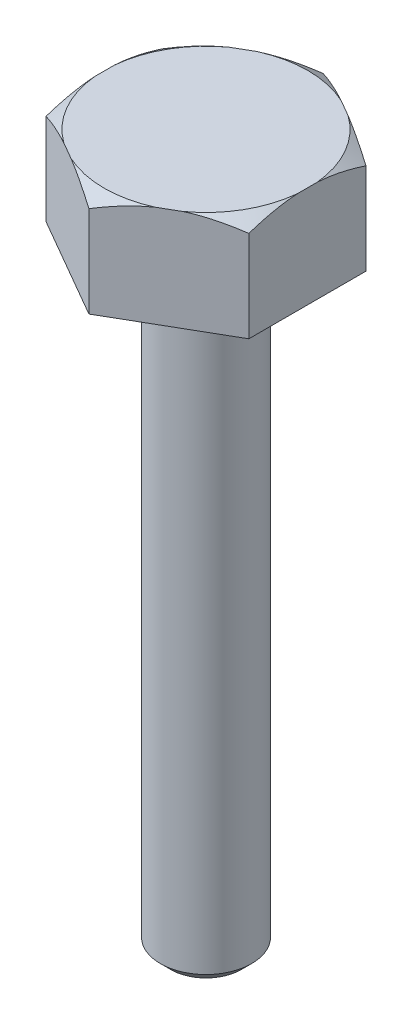
ISO-10303-21;
HEADER;
FILE_DESCRIPTION(('STEP AP214'),'2;1');
FILE_NAME('part.step','',(''),(''),'','','');
FILE_SCHEMA(('AUTOMOTIVE_DESIGN { 1 0 10303 214 1 1 1 1 }'));
ENDSEC;
DATA;
#1=APPLICATION_CONTEXT('core data for automotive mechanical design processes');
#2=APPLICATION_PROTOCOL_DEFINITION('international standard','automotive_design',2000,#1);
#3=PRODUCT_CONTEXT('',#1,'mechanical');
#4=PRODUCT('Part','Part','',(#3));
#5=PRODUCT_RELATED_PRODUCT_CATEGORY('part','',(#4));
#6=PRODUCT_DEFINITION_FORMATION('','',#4);
#7=PRODUCT_DEFINITION_CONTEXT('part definition',#1,'design');
#8=PRODUCT_DEFINITION('design','',#6,#7);
#9=PRODUCT_DEFINITION_SHAPE('','',#8);
#10=(LENGTH_UNIT() NAMED_UNIT(*) SI_UNIT(.MILLI.,.METRE.));
#11=(NAMED_UNIT(*) PLANE_ANGLE_UNIT() SI_UNIT($,.RADIAN.));
#12=(NAMED_UNIT(*) SI_UNIT($,.STERADIAN.) SOLID_ANGLE_UNIT());
#13=UNCERTAINTY_MEASURE_WITH_UNIT(LENGTH_MEASURE(1.E-05),#10,'distance_accuracy_value','');
#14=(GEOMETRIC_REPRESENTATION_CONTEXT(3) GLOBAL_UNCERTAINTY_ASSIGNED_CONTEXT((#13)) GLOBAL_UNIT_ASSIGNED_CONTEXT((#10,
#11,#12)) REPRESENTATION_CONTEXT('',''));
#15=CARTESIAN_POINT('',(0.,0.,0.));
#16=DIRECTION('',(0.,0.,1.));
#17=DIRECTION('',(1.,0.,0.));
#18=AXIS2_PLACEMENT_3D('',#15,#16,#17);
#19=CARTESIAN_POINT('',(10.,10.,5.77350269189626));
#20=DIRECTION('',(-1.,0.,0.));
#21=DIRECTION('',(0.,0.,1.));
#22=AXIS2_PLACEMENT_3D('',#19,#20,#21);
#23=PLANE('',#22);
#24=CARTESIAN_POINT('',(10.,5.90710487205311,12.7278381521818));
#25=CARTESIAN_POINT('',(10.,6.0793608945057,12.3991739928138));
#26=CARTESIAN_POINT('',(10.,6.24968099015636,12.0694790466941));
#27=CARTESIAN_POINT('',(10.,6.58558397838257,11.4076219385313));
#28=CARTESIAN_POINT('',(10.,6.75116612019231,11.0754593958673));
#29=CARTESIAN_POINT('',(10.,7.07732703508568,10.407024430958));
#30=CARTESIAN_POINT('',(10.,7.23788302774356,10.0707408569199));
#31=CARTESIAN_POINT('',(10.,7.55210202224716,9.39497602551654));
#32=CARTESIAN_POINT('',(10.,7.70576530282682,9.05549489813003));
#33=CARTESIAN_POINT('',(10.,8.00927566950978,8.36252264170041));
#34=CARTESIAN_POINT('',(10.,8.15886619139366,8.00891861228615));
#35=CARTESIAN_POINT('',(10.,8.4472048566987,7.29726965705877));
#36=CARTESIAN_POINT('',(10.,8.58595232444728,6.9392244561074));
#37=CARTESIAN_POINT('',(10.,8.84995208670938,6.21870019113016));
#38=CARTESIAN_POINT('',(10.,8.97522243658759,5.85622780231769));
#39=CARTESIAN_POINT('',(10.,9.20950318873454,5.12611915020338));
#40=CARTESIAN_POINT('',(10.,9.31851639916821,4.7584837907556));
#41=CARTESIAN_POINT('',(10.,9.5438112265742,3.91739891893107));
#42=CARTESIAN_POINT('',(10.,9.65405513012926,3.44227582673843));
#43=CARTESIAN_POINT('',(10.,9.7901035463059,2.72409819473514));
#44=CARTESIAN_POINT('',(10.,9.83056825541876,2.48377623878417));
#45=CARTESIAN_POINT('',(10.,9.90090920007325,2.00159868929574));
#46=CARTESIAN_POINT('',(10.,9.93078683361545,1.75974330254088));
#47=CARTESIAN_POINT('',(10.,9.97896446679237,1.27801559182015));
#48=CARTESIAN_POINT('',(10.,9.99740826493851,1.03815770536422));
#49=CARTESIAN_POINT('',(10.,10.0228797231995,0.557835301316692));
#50=CARTESIAN_POINT('',(10.,10.0299075686807,0.317370793638596));
#51=CARTESIAN_POINT('',(10.,10.0323722742339,-0.163616190497004));
#52=CARTESIAN_POINT('',(10.,10.0278092726359,-0.404138666228438));
#53=CARTESIAN_POINT('',(10.,10.0072085105673,-0.884692060751066));
#54=CARTESIAN_POINT('',(10.,9.99117033460514,-1.12472296142777));
#55=CARTESIAN_POINT('',(10.,9.94316490868695,-1.65739414366833));
#56=CARTESIAN_POINT('',(10.,9.90843636972063,-1.94978825759404));
#57=CARTESIAN_POINT('',(10.,9.82352041266941,-2.5322999579852));
#58=CARTESIAN_POINT('',(10.,9.77333166127009,-2.82241734588821));
#59=CARTESIAN_POINT('',(10.,9.60171649432357,-3.68890923952759));
#60=CARTESIAN_POINT('',(10.,9.45926389047211,-4.2611943504674));
#61=CARTESIAN_POINT('',(10.,9.21223995234808,-5.11364139885107));
#62=CARTESIAN_POINT('',(10.,9.12363063044356,-5.39868822190394));
#63=CARTESIAN_POINT('',(10.,8.93689518426824,-5.96565181537131));
#64=CARTESIAN_POINT('',(10.,8.83876970691451,-6.24756879710526));
#65=CARTESIAN_POINT('',(10.,8.63440863817487,-6.80835229691252));
#66=CARTESIAN_POINT('',(10.,8.52817485639805,-7.08721947984736));
#67=CARTESIAN_POINT('',(10.,8.30876965193712,-7.64219843636143));
#68=CARTESIAN_POINT('',(10.,8.19559832320646,-7.91831024719711));
#69=CARTESIAN_POINT('',(10.,7.9146653538985,-8.58323815267785));
#70=CARTESIAN_POINT('',(10.,7.74390466905314,-8.97078570232952));
#71=CARTESIAN_POINT('',(10.,7.39286933651772,-9.74148543574943));
#72=CARTESIAN_POINT('',(10.,7.21259541129671,-10.1246379506095));
#73=CARTESIAN_POINT('',(10.,6.84807916806974,-10.8795038731173));
#74=CARTESIAN_POINT('',(10.,6.66399094175462,-11.2512918755448));
#75=CARTESIAN_POINT('',(10.,6.38334017731839,-11.8066579263679));
#76=CARTESIAN_POINT('',(10.,6.28904124641967,-11.9913855961491));
#77=CARTESIAN_POINT('',(10.,6.09906999520468,-12.36012988653));
#78=CARTESIAN_POINT('',(10.,6.00339769671645,-12.5441465183719));
#79=CARTESIAN_POINT('',(10.,5.90710487205311,-12.7278381521818));
#80=B_SPLINE_CURVE_WITH_KNOTS('',3,(#24,#25,#26,#27,#28,#29,#30,#31,#32,#33,#34,#35,#36,#37,#38,
#39,#40,#41,#42,#43,#44,#45,#46,#47,#48,#49,#50,#51,#52,#53,#54,#55,#56,#57,#58,#59,#60,#61,#62,
#63,#64,#65,#66,#67,#68,#69,#70,#71,#72,#73,#74,#75,#76,#77,#78,#79),.UNSPECIFIED.,.F.,.F.,(4,2,
2,2,2,2,2,2,2,2,2,2,2,2,2,2,2,2,2,2,2,2,2,2,2,2,2,4),(0.,1.1132220881002,2.22661960890332,
3.34449140753772,4.46231795979545,5.61400246244217,6.76575867386764,7.91595213551715,
9.06594668865214,10.527621110013,11.2585419996432,11.989366336743,12.7108023269516,
13.4322266027293,14.1536422687566,14.8750840570248,15.7579562722943,16.6409046492578,
18.4074890402685,19.3028973916684,20.1982449149911,21.0933931959392,21.9885293567959,
23.2588570642324,24.5290884369467,25.7736192532948,26.3958280254714,27.0180269193105),.UNSPECIFIED.);
#81=CARTESIAN_POINT('',(10.,9.,5.77350269189626));
#82=VERTEX_POINT('',#81);
#83=CARTESIAN_POINT('',(10.,10.,0.970730231297982));
#84=VERTEX_POINT('',#83);
#85=EDGE_CURVE('E213',#82,#84,#80,.T.);
#86=ORIENTED_EDGE('',*,*,#85,.F.);
#87=DIRECTION('',(0.,-1.,0.));
#88=VECTOR('',#87,1.);
#89=CARTESIAN_POINT('',(10.,10.,5.77350269189626));
#90=LINE('',#89,#88);
#91=CARTESIAN_POINT('',(10.,0.,5.77350269189626));
#92=VERTEX_POINT('',#91);
#93=EDGE_CURVE('E166',#82,#92,#90,.T.);
#94=ORIENTED_EDGE('',*,*,#93,.T.);
#95=DIRECTION('',(0.,0.,-1.));
#96=VECTOR('',#95,1.);
#97=CARTESIAN_POINT('',(10.,0.,5.77350269189626));
#98=LINE('',#97,#96);
#99=CARTESIAN_POINT('',(10.,0.,-5.77350269189626));
#100=VERTEX_POINT('',#99);
#101=EDGE_CURVE('E167',#92,#100,#98,.T.);
#102=ORIENTED_EDGE('',*,*,#101,.T.);
#103=DIRECTION('',(0.,-1.,0.));
#104=VECTOR('',#103,1.);
#105=CARTESIAN_POINT('',(10.,10.,-5.77350269189626));
#106=LINE('',#105,#104);
#107=CARTESIAN_POINT('',(10.,9.,-5.77350269189626));
#108=VERTEX_POINT('',#107);
#109=EDGE_CURVE('E192',#108,#100,#106,.T.);
#110=ORIENTED_EDGE('',*,*,#109,.F.);
#111=CARTESIAN_POINT('',(10.,10.,-0.970730231297985));
#112=VERTEX_POINT('',#111);
#113=EDGE_CURVE('E171',#112,#108,#80,.T.);
#114=ORIENTED_EDGE('',*,*,#113,.F.);
#115=DIRECTION('',(0.,0.,-1.));
#116=VECTOR('',#115,1.);
#117=CARTESIAN_POINT('',(10.,10.,5.77350269189626));
#118=LINE('',#117,#116);
#119=EDGE_CURVE('E152',#84,#112,#118,.T.);
#120=ORIENTED_EDGE('',*,*,#119,.F.);
#121=EDGE_LOOP('',(#86,#94,#102,#110,#114,#120));
#122=FACE_BOUND('',#121,.T.);
#123=ADVANCED_FACE('F36',(#122),#23,.F.);
#124=CARTESIAN_POINT('',(10.,10.,-5.77350269189626));
#125=DIRECTION('',(-0.5,0.,0.866025403784439));
#126=DIRECTION('',(0.866025403784439,0.,0.5));
#127=AXIS2_PLACEMENT_3D('',#124,#125,#126);
#128=PLANE('',#127);
#129=CARTESIAN_POINT('',(16.9543354602855,5.33448466897945,-1.75841524186548));
#130=CARTESIAN_POINT('',(16.6704137607809,5.51145277088848,-1.92233751150323));
#131=CARTESIAN_POINT('',(16.3857196591728,5.68678909450409,-2.08670572770335));
#132=CARTESIAN_POINT('',(15.8144915562484,6.03350198488177,-2.41650442669546));
#133=CARTESIAN_POINT('',(15.5279573620131,6.20487812749486,-2.5819350208692));
#134=CARTESIAN_POINT('',(14.9520245008826,6.54340070743476,-2.91445001327807));
#135=CARTESIAN_POINT('',(14.6626201277199,6.71053423355476,-3.08153770602822));
#136=CARTESIAN_POINT('',(14.0814138970546,7.03913600953292,-3.41709727975749));
#137=CARTESIAN_POINT('',(13.7896121071779,7.20060441851889,-3.58556912169285));
#138=CARTESIAN_POINT('',(13.1922435480544,7.52265202608774,-3.93046002010821));
#139=CARTESIAN_POINT('',(12.886571036726,7.682970656885,-4.10694012680755));
#140=CARTESIAN_POINT('',(12.2717880587656,7.99464932850734,-4.46188524462614));
#141=CARTESIAN_POINT('',(11.9626774287477,8.14600894140303,-4.6403503500764));
#142=CARTESIAN_POINT('',(11.3408408593908,8.43759366634361,-4.99936786078655));
#143=CARTESIAN_POINT('',(11.0281184092735,8.57782863793539,-5.17991825154337));
#144=CARTESIAN_POINT('',(10.3983945917163,8.84477102159408,-5.54348946712514));
#145=CARTESIAN_POINT('',(10.0813937649079,8.97148012514163,-5.72650997981632));
#146=CARTESIAN_POINT('',(9.35638854026435,9.24040337276739,-6.14509194142816));
#147=CARTESIAN_POINT('',(8.94695084408709,9.37754811232443,-6.38148090553249));
#148=CARTESIAN_POINT('',(8.12049296208359,9.6178672707041,-6.8586365861811));
#149=CARTESIAN_POINT('',(7.70347355423212,9.72104515440548,-7.09940285356144));
#150=CARTESIAN_POINT('',(7.07646123997761,9.84412014332748,-7.46140858198149));
#151=CARTESIAN_POINT('',(6.86874036610463,9.87971486939361,-7.58133628442836));
#152=CARTESIAN_POINT('',(6.45210967836269,9.94010302166208,-7.82187812414883));
#153=CARTESIAN_POINT('',(6.24319987799829,9.96489657030385,-7.94249225362557));
#154=CARTESIAN_POINT('',(5.82463252595282,10.0030927826117,-8.18415222700301));
#155=CARTESIAN_POINT('',(5.61497510550477,10.0164973552735,-8.30519799513629));
#156=CARTESIAN_POINT('',(5.19534157967948,10.0315930622517,-8.54747352423252));
#157=CARTESIAN_POINT('',(4.985365474736,10.0332842124966,-8.66870328494502));
#158=CARTESIAN_POINT('',(4.56484506581673,10.024894612638,-8.9114908562343));
#159=CARTESIAN_POINT('',(4.3543013916357,10.0147720423244,-9.03304830319889));
#160=CARTESIAN_POINT('',(3.93387618451524,9.98294146890358,-9.27578090970399));
#161=CARTESIAN_POINT('',(3.72399465548885,9.96123339745866,-9.3969560669853));
#162=CARTESIAN_POINT('',(3.30528455326484,9.90674675318179,-9.63869845721675));
#163=CARTESIAN_POINT('',(3.09645615011703,9.87396644714387,-9.75926559198858));
#164=CARTESIAN_POINT('',(2.68020424868778,9.79806123324148,-9.99958873932945));
#165=CARTESIAN_POINT('',(2.47278093049621,9.7549350242044,-10.1193446479236));
#166=CARTESIAN_POINT('',(1.84700505701181,9.60991413336595,-10.4806365169322));
#167=CARTESIAN_POINT('',(1.43119724267965,9.49320530038334,-10.720703270468));
#168=CARTESIAN_POINT('',(0.607340392312998,9.22836185810968,-11.1963572448009));
#169=CARTESIAN_POINT('',(0.199291716875844,9.0802257921435,-11.431944257407));
#170=CARTESIAN_POINT('',(-0.503328503874636,8.80158574903133,-11.8376022309954));
#171=CARTESIAN_POINT('',(-0.799582442185761,8.67665383395842,-12.0086445220278));
#172=CARTESIAN_POINT('',(-1.388449257834,8.41578651425678,-12.3486269365591));
#173=CARTESIAN_POINT('',(-1.6810618335193,8.27985020492911,-12.5175668858993));
#174=CARTESIAN_POINT('',(-2.26316262285532,7.99884677130784,-12.8536429333179));
#175=CARTESIAN_POINT('',(-2.55264892009115,7.85377438171831,-13.0207779249538));
#176=CARTESIAN_POINT('',(-3.12872215724987,7.55614106935374,-13.3533739635003));
#177=CARTESIAN_POINT('',(-3.41530899537535,7.40357988474669,-13.5188349516382));
#178=CARTESIAN_POINT('',(-3.97604761078438,7.09764282591256,-13.8425775421896));
#179=CARTESIAN_POINT('',(-4.25028616713557,6.94447836928975,-14.0009092465212));
#180=CARTESIAN_POINT('',(-4.79668855480026,6.63328437427349,-14.3163748121252));
#181=CARTESIAN_POINT('',(-5.06885234132085,6.47525473121289,-14.4735086475366));
#182=CARTESIAN_POINT('',(-5.61082202718766,6.15541192138462,-14.7864149915644));
#183=CARTESIAN_POINT('',(-5.88063153509444,5.99360688945241,-14.9421895835843));
#184=CARTESIAN_POINT('',(-6.4186347822641,5.6665138915747,-15.2528059031626));
#185=CARTESIAN_POINT('',(-6.68682865499916,5.5012262185582,-15.4076477077812));
#186=CARTESIAN_POINT('',(-6.95433546028548,5.33448466897945,-15.5620928338233));
#187=B_SPLINE_CURVE_WITH_KNOTS('',3,(#129,#130,#131,#132,#133,#134,#135,#136,#137,#138,#139,
#140,#141,#142,#143,#144,#145,#146,#147,#148,#149,#150,#151,#152,#153,#154,#155,#156,#157,#158,
#159,#160,#161,#162,#163,#164,#165,#166,#167,#168,#169,#170,#171,#172,#173,#174,#175,#176,#177,
#178,#179,#180,#181,#182,#183,#184,#185,#186),.UNSPECIFIED.,.F.,.F.,(4,2,2,2,2,2,2,2,2,2,2,2,2,
2,2,2,2,2,2,2,2,2,2,2,2,2,2,2,4),(0.,1.11768502353013,2.23548920527297,3.35636377904495,
4.4772068432577,5.64009509576005,6.80303884911568,7.96494011798363,9.12669591436867,
10.602535349934,12.0782241919218,12.8054650783283,13.5326977207007,14.2598084418315,
14.9869181741972,15.7166096799222,16.4463054898204,17.1761155765329,17.9060174973924,
19.3868621036758,20.8677753631874,21.9601216940293,23.0525579207918,24.1456296053234,
25.2387395343665,26.2939712635857,27.3492257104102,28.4023850301391,29.4554561182629),.UNSPECIFIED.);
#188=CARTESIAN_POINT('',(5.8406770405256,10.,-8.1748889221954));
#189=VERTEX_POINT('',#188);
#190=EDGE_CURVE('E145',#108,#189,#187,.T.);
#191=ORIENTED_EDGE('',*,*,#190,.F.);
#192=ORIENTED_EDGE('',*,*,#109,.T.);
#193=DIRECTION('',(-0.866025403784439,0.,-0.5));
#194=VECTOR('',#193,1.);
#195=CARTESIAN_POINT('',(10.,0.,-5.77350269189626));
#196=LINE('',#195,#194);
#197=CARTESIAN_POINT('',(0.,0.,-11.5470053837925));
#198=VERTEX_POINT('',#197);
#199=EDGE_CURVE('E170',#100,#198,#196,.T.);
#200=ORIENTED_EDGE('',*,*,#199,.T.);
#201=DIRECTION('',(0.,-1.,0.));
#202=VECTOR('',#201,1.);
#203=CARTESIAN_POINT('',(0.,10.,-11.5470053837925));
#204=LINE('',#203,#202);
#205=CARTESIAN_POINT('',(0.,9.,-11.5470053837925));
#206=VERTEX_POINT('',#205);
#207=EDGE_CURVE('E144',#206,#198,#204,.T.);
#208=ORIENTED_EDGE('',*,*,#207,.F.);
#209=CARTESIAN_POINT('',(4.1593229594744,10.,-9.14561915349338));
#210=VERTEX_POINT('',#209);
#211=EDGE_CURVE('E127',#210,#206,#187,.T.);
#212=ORIENTED_EDGE('',*,*,#211,.F.);
#213=DIRECTION('',(-0.866025403784439,0.,-0.5));
#214=VECTOR('',#213,1.);
#215=CARTESIAN_POINT('',(10.,10.,-5.77350269189626));
#216=LINE('',#215,#214);
#217=EDGE_CURVE('E142',#189,#210,#216,.T.);
#218=ORIENTED_EDGE('',*,*,#217,.F.);
#219=EDGE_LOOP('',(#191,#192,#200,#208,#212,#218));
#220=FACE_BOUND('',#219,.T.);
#221=ADVANCED_FACE('F141',(#220),#128,.F.);
#222=CARTESIAN_POINT('',(0.,10.,-11.5470053837925));
#223=DIRECTION('',(0.5,0.,0.866025403784439));
#224=DIRECTION('',(0.866025403784439,0.,-0.5));
#225=AXIS2_PLACEMENT_3D('',#222,#223,#224);
#226=PLANE('',#225);
#227=CARTESIAN_POINT('',(6.95433546028548,5.33448466897945,-15.5620928338233));
#228=CARTESIAN_POINT('',(6.67041376078089,5.51145277088848,-15.3981705641855));
#229=CARTESIAN_POINT('',(6.38571965917281,5.68678909450409,-15.2338023479854));
#230=CARTESIAN_POINT('',(5.81449155624836,6.03350198488177,-14.9040036489933));
#231=CARTESIAN_POINT('',(5.52795736201314,6.20487812749486,-14.7385730548196));
#232=CARTESIAN_POINT('',(4.9520245008826,6.54340070743476,-14.4060580624107));
#233=CARTESIAN_POINT('',(4.66262012771988,6.71053423355476,-14.2389703696606));
#234=CARTESIAN_POINT('',(4.08141389705462,7.03913600953292,-13.9034107959313));
#235=CARTESIAN_POINT('',(3.78961210717787,7.20060441851889,-13.7349389539959));
#236=CARTESIAN_POINT('',(3.19224354805439,7.52265202608774,-13.3900480555806));
#237=CARTESIAN_POINT('',(2.88657103672596,7.68297065688501,-13.2135679488812));
#238=CARTESIAN_POINT('',(2.27178805876564,7.99464932850734,-12.8586228310626));
#239=CARTESIAN_POINT('',(1.96267742874766,8.14600894140303,-12.6801577256124));
#240=CARTESIAN_POINT('',(1.34084085939078,8.43759366634361,-12.3211402149022));
#241=CARTESIAN_POINT('',(1.02811840927355,8.57782863793539,-12.1405898241454));
#242=CARTESIAN_POINT('',(0.398394591716341,8.84477102159408,-11.7770186085636));
#243=CARTESIAN_POINT('',(0.0813937649079103,8.97148012514163,-11.5939980958725));
#244=CARTESIAN_POINT('',(-0.643611459735645,9.24040337276739,-11.1754161342606));
#245=CARTESIAN_POINT('',(-1.05304915591291,9.37754811232444,-10.9390271701563));
#246=CARTESIAN_POINT('',(-1.87950703791641,9.6178672707041,-10.4618714895077));
#247=CARTESIAN_POINT('',(-2.29652644576788,9.72104515440548,-10.2211052221273));
#248=CARTESIAN_POINT('',(-2.92353876002239,9.84412014332748,-9.85909949370729));
#249=CARTESIAN_POINT('',(-3.13125963389537,9.87971486939361,-9.73917179126042));
#250=CARTESIAN_POINT('',(-3.54789032163732,9.94010302166208,-9.49862995153995));
#251=CARTESIAN_POINT('',(-3.75680012200171,9.96489657030385,-9.37801582206321));
#252=CARTESIAN_POINT('',(-4.17536747404718,10.0030927826117,-9.13635584868578));
#253=CARTESIAN_POINT('',(-4.38502489449523,10.0164973552735,-9.01531008055249));
#254=CARTESIAN_POINT('',(-4.80465842032052,10.0315930622517,-8.77303455145627));
#255=CARTESIAN_POINT('',(-5.014634525264,10.0332842124966,-8.65180479074376));
#256=CARTESIAN_POINT('',(-5.43515493418327,10.024894612638,-8.40901721945449));
#257=CARTESIAN_POINT('',(-5.6456986083643,10.0147720423244,-8.2874597724899));
#258=CARTESIAN_POINT('',(-6.06612381548476,9.98294146890358,-8.04472716598479));
#259=CARTESIAN_POINT('',(-6.27600534451115,9.96123339745866,-7.92355200870348));
#260=CARTESIAN_POINT('',(-6.69471544673516,9.90674675318179,-7.68180961847203));
#261=CARTESIAN_POINT('',(-6.90354384988297,9.87396644714387,-7.56124248370021));
#262=CARTESIAN_POINT('',(-7.31979575131222,9.79806123324148,-7.32091933635933));
#263=CARTESIAN_POINT('',(-7.52721906950379,9.7549350242044,-7.20116342776522));
#264=CARTESIAN_POINT('',(-8.15299494298819,9.60991413336595,-6.83987155875663));
#265=CARTESIAN_POINT('',(-8.56880275732035,9.49320530038334,-6.59980480522081));
#266=CARTESIAN_POINT('',(-9.392659607687,9.22836185810968,-6.12415083088791));
#267=CARTESIAN_POINT('',(-9.80070828312416,9.0802257921435,-5.88856381828179));
#268=CARTESIAN_POINT('',(-10.5033285038746,8.80158574903133,-5.48290584469343));
#269=CARTESIAN_POINT('',(-10.7995824421858,8.67665383395842,-5.31186355366102));
#270=CARTESIAN_POINT('',(-11.388449257834,8.41578651425678,-4.97188113912967));
#271=CARTESIAN_POINT('',(-11.6810618335193,8.27985020492911,-4.80294118978949));
#272=CARTESIAN_POINT('',(-12.2631626228553,7.99884677130784,-4.46686514237085));
#273=CARTESIAN_POINT('',(-12.5526489200912,7.85377438171831,-4.29973015073503));
#274=CARTESIAN_POINT('',(-13.1287221572499,7.55614106935375,-3.96713411218851));
#275=CARTESIAN_POINT('',(-13.4153089953753,7.40357988474669,-3.80167312405056));
#276=CARTESIAN_POINT('',(-13.9760476107844,7.09764282591256,-3.47793053349914));
#277=CARTESIAN_POINT('',(-14.2502861671356,6.94447836928975,-3.31959882916761));
#278=CARTESIAN_POINT('',(-14.7966885548003,6.63328437427349,-3.00413326356354));
#279=CARTESIAN_POINT('',(-15.0688523413208,6.47525473121289,-2.84699942815221));
#280=CARTESIAN_POINT('',(-15.6108220271877,6.15541192138462,-2.53409308412439));
#281=CARTESIAN_POINT('',(-15.8806315350944,5.99360688945241,-2.37831849210449));
#282=CARTESIAN_POINT('',(-16.4186347822641,5.6665138915747,-2.06770217252619));
#283=CARTESIAN_POINT('',(-16.6868286549992,5.5012262185582,-1.9128603679076));
#284=CARTESIAN_POINT('',(-16.9543354602855,5.33448466897945,-1.75841524186548));
#285=B_SPLINE_CURVE_WITH_KNOTS('',3,(#227,#228,#229,#230,#231,#232,#233,#234,#235,#236,#237,
#238,#239,#240,#241,#242,#243,#244,#245,#246,#247,#248,#249,#250,#251,#252,#253,#254,#255,#256,
#257,#258,#259,#260,#261,#262,#263,#264,#265,#266,#267,#268,#269,#270,#271,#272,#273,#274,#275,
#276,#277,#278,#279,#280,#281,#282,#283,#284),.UNSPECIFIED.,.F.,.F.,(4,2,2,2,2,2,2,2,2,2,2,2,2,
2,2,2,2,2,2,2,2,2,2,2,2,2,2,2,4),(0.,1.11768502353013,2.23548920527297,3.35636377904495,
4.4772068432577,5.64009509576005,6.80303884911568,7.96494011798362,9.12669591436866,
10.602535349934,12.0782241919218,12.8054650783284,13.5326977207007,14.2598084418315,
14.9869181741972,15.7166096799222,16.4463054898204,17.1761155765329,17.9060174973924,
19.3868621036758,20.8677753631873,21.9601216940293,23.0525579207918,24.1456296053234,
25.2387395343665,26.2939712635857,27.3492257104102,28.4023850301391,29.4554561182629),.UNSPECIFIED.);
#286=CARTESIAN_POINT('',(-4.15932295947443,10.,-9.14561915349337));
#287=VERTEX_POINT('',#286);
#288=EDGE_CURVE('E129',#206,#287,#285,.T.);
#289=ORIENTED_EDGE('',*,*,#288,.F.);
#290=ORIENTED_EDGE('',*,*,#207,.T.);
#291=DIRECTION('',(-0.866025403784439,0.,0.5));
#292=VECTOR('',#291,1.);
#293=CARTESIAN_POINT('',(0.,0.,-11.5470053837925));
#294=LINE('',#293,#292);
#295=CARTESIAN_POINT('',(-10.,0.,-5.77350269189626));
#296=VERTEX_POINT('',#295);
#297=EDGE_CURVE('E173',#198,#296,#294,.T.);
#298=ORIENTED_EDGE('',*,*,#297,.T.);
#299=DIRECTION('',(0.,-1.,0.));
#300=VECTOR('',#299,1.);
#301=CARTESIAN_POINT('',(-10.,10.,-5.77350269189626));
#302=LINE('',#301,#300);
#303=CARTESIAN_POINT('',(-10.,9.,-5.77350269189627));
#304=VERTEX_POINT('',#303);
#305=EDGE_CURVE('E189',#304,#296,#302,.T.);
#306=ORIENTED_EDGE('',*,*,#305,.F.);
#307=CARTESIAN_POINT('',(-5.84067704052557,10.,-8.17488892219542));
#308=VERTEX_POINT('',#307);
#309=EDGE_CURVE('E247',#308,#304,#285,.T.);
#310=ORIENTED_EDGE('',*,*,#309,.F.);
#311=DIRECTION('',(-0.866025403784439,0.,0.5));
#312=VECTOR('',#311,1.);
#313=CARTESIAN_POINT('',(0.,10.,-11.5470053837925));
#314=LINE('',#313,#312);
#315=EDGE_CURVE('E151',#287,#308,#314,.T.);
#316=ORIENTED_EDGE('',*,*,#315,.F.);
#317=EDGE_LOOP('',(#289,#290,#298,#306,#310,#316));
#318=FACE_BOUND('',#317,.T.);
#319=ADVANCED_FACE('F257',(#318),#226,.F.);
#320=CARTESIAN_POINT('',(-10.,10.,-5.77350269189626));
#321=DIRECTION('',(1.,0.,0.));
#322=DIRECTION('',(0.,0.,-1.));
#323=AXIS2_PLACEMENT_3D('',#320,#321,#322);
#324=PLANE('',#323);
#325=CARTESIAN_POINT('',(-10.,5.90710487205311,-12.7278381521818));
#326=CARTESIAN_POINT('',(-10.,6.0793608945057,-12.3991739928138));
#327=CARTESIAN_POINT('',(-10.,6.24968099015636,-12.0694790466942));
#328=CARTESIAN_POINT('',(-10.,6.58558397838257,-11.4076219385313));
#329=CARTESIAN_POINT('',(-10.,6.75116612019231,-11.0754593958673));
#330=CARTESIAN_POINT('',(-10.,7.07732703508567,-10.407024430958));
#331=CARTESIAN_POINT('',(-10.,7.23788302774356,-10.0707408569199));
#332=CARTESIAN_POINT('',(-10.,7.55210202224716,-9.39497602551654));
#333=CARTESIAN_POINT('',(-10.,7.70576530282682,-9.05549489813003));
#334=CARTESIAN_POINT('',(-10.,8.00927566950978,-8.36252264170041));
#335=CARTESIAN_POINT('',(-10.,8.15886619139366,-8.00891861228615));
#336=CARTESIAN_POINT('',(-10.,8.4472048566987,-7.29726965705877));
#337=CARTESIAN_POINT('',(-10.,8.58595232444728,-6.9392244561074));
#338=CARTESIAN_POINT('',(-10.,8.84995208670938,-6.21870019113016));
#339=CARTESIAN_POINT('',(-10.,8.97522243658759,-5.85622780231769));
#340=CARTESIAN_POINT('',(-10.,9.20950318873454,-5.12611915020338));
#341=CARTESIAN_POINT('',(-10.,9.31851639916821,-4.75848379075559));
#342=CARTESIAN_POINT('',(-10.,9.5438112265742,-3.91739891893107));
#343=CARTESIAN_POINT('',(-10.,9.65405513012927,-3.44227582673843));
#344=CARTESIAN_POINT('',(-10.,9.7901035463059,-2.72409819473514));
#345=CARTESIAN_POINT('',(-10.,9.83056825541876,-2.48377623878417));
#346=CARTESIAN_POINT('',(-10.,9.90090920007325,-2.00159868929573));
#347=CARTESIAN_POINT('',(-10.,9.93078683361546,-1.75974330254087));
#348=CARTESIAN_POINT('',(-10.,9.97896446679237,-1.27801559182014));
#349=CARTESIAN_POINT('',(-10.,9.99740826493851,-1.03815770536422));
#350=CARTESIAN_POINT('',(-10.,10.0228797231995,-0.557835301316689));
#351=CARTESIAN_POINT('',(-10.,10.0299075686807,-0.317370793638593));
#352=CARTESIAN_POINT('',(-10.,10.0323722742339,0.163616190497007));
#353=CARTESIAN_POINT('',(-10.,10.0278092726359,0.404138666228441));
#354=CARTESIAN_POINT('',(-10.,10.0072085105673,0.884692060751069));
#355=CARTESIAN_POINT('',(-10.,9.99117033460514,1.12472296142778));
#356=CARTESIAN_POINT('',(-10.,9.94316490868695,1.65739414366833));
#357=CARTESIAN_POINT('',(-10.,9.90843636972063,1.94978825759404));
#358=CARTESIAN_POINT('',(-10.,9.82352041266941,2.5322999579852));
#359=CARTESIAN_POINT('',(-10.,9.77333166127009,2.82241734588821));
#360=CARTESIAN_POINT('',(-10.,9.60171649432358,3.68890923952759));
#361=CARTESIAN_POINT('',(-10.,9.45926389047211,4.2611943504674));
#362=CARTESIAN_POINT('',(-10.,9.21223995234808,5.11364139885107));
#363=CARTESIAN_POINT('',(-10.,9.12363063044356,5.39868822190394));
#364=CARTESIAN_POINT('',(-10.,8.93689518426824,5.96565181537132));
#365=CARTESIAN_POINT('',(-10.,8.83876970691451,6.24756879710526));
#366=CARTESIAN_POINT('',(-10.,8.63440863817487,6.80835229691253));
#367=CARTESIAN_POINT('',(-10.,8.52817485639805,7.08721947984736));
#368=CARTESIAN_POINT('',(-10.,8.30876965193712,7.64219843636143));
#369=CARTESIAN_POINT('',(-10.,8.19559832320646,7.91831024719711));
#370=CARTESIAN_POINT('',(-10.,7.9146653538985,8.58323815267785));
#371=CARTESIAN_POINT('',(-10.,7.74390466905314,8.97078570232952));
#372=CARTESIAN_POINT('',(-10.,7.39286933651772,9.74148543574943));
#373=CARTESIAN_POINT('',(-10.,7.21259541129671,10.1246379506095));
#374=CARTESIAN_POINT('',(-10.,6.84807916806974,10.8795038731173));
#375=CARTESIAN_POINT('',(-10.,6.66399094175462,11.2512918755448));
#376=CARTESIAN_POINT('',(-10.,6.38334017731839,11.8066579263679));
#377=CARTESIAN_POINT('',(-10.,6.28904124641967,11.9913855961491));
#378=CARTESIAN_POINT('',(-10.,6.09906999520468,12.36012988653));
#379=CARTESIAN_POINT('',(-10.,6.00339769671645,12.5441465183719));
#380=CARTESIAN_POINT('',(-10.,5.90710487205311,12.7278381521817));
#381=B_SPLINE_CURVE_WITH_KNOTS('',3,(#325,#326,#327,#328,#329,#330,#331,#332,#333,#334,#335,
#336,#337,#338,#339,#340,#341,#342,#343,#344,#345,#346,#347,#348,#349,#350,#351,#352,#353,#354,
#355,#356,#357,#358,#359,#360,#361,#362,#363,#364,#365,#366,#367,#368,#369,#370,#371,#372,#373,
#374,#375,#376,#377,#378,#379,#380),.UNSPECIFIED.,.F.,.F.,(4,2,2,2,2,2,2,2,2,2,2,2,2,2,2,2,2,2,
2,2,2,2,2,2,2,2,2,4),(0.,1.1132220881002,2.22661960890332,3.34449140753772,4.46231795979545,
5.61400246244217,6.76575867386764,7.91595213551716,9.06594668865214,10.527621110013,
11.2585419996432,11.989366336743,12.7108023269516,13.4322266027293,14.1536422687566,
14.8750840570248,15.7579562722943,16.6409046492578,18.4074890402685,19.3028973916684,
20.1982449149911,21.0933931959392,21.9885293567959,23.2588570642324,24.5290884369467,
25.7736192532948,26.3958280254714,27.0180269193105),.UNSPECIFIED.);
#382=CARTESIAN_POINT('',(-10.,10.,-0.970730231297983));
#383=VERTEX_POINT('',#382);
#384=EDGE_CURVE('E252',#304,#383,#381,.T.);
#385=ORIENTED_EDGE('',*,*,#384,.F.);
#386=ORIENTED_EDGE('',*,*,#305,.T.);
#387=DIRECTION('',(0.,0.,1.));
#388=VECTOR('',#387,1.);
#389=CARTESIAN_POINT('',(-10.,0.,-5.77350269189626));
#390=LINE('',#389,#388);
#391=CARTESIAN_POINT('',(-10.,0.,5.77350269189626));
#392=VERTEX_POINT('',#391);
#393=EDGE_CURVE('E176',#296,#392,#390,.T.);
#394=ORIENTED_EDGE('',*,*,#393,.T.);
#395=DIRECTION('',(0.,-1.,0.));
#396=VECTOR('',#395,1.);
#397=CARTESIAN_POINT('',(-10.,10.,5.77350269189626));
#398=LINE('',#397,#396);
#399=CARTESIAN_POINT('',(-10.,9.,5.77350269189626));
#400=VERTEX_POINT('',#399);
#401=EDGE_CURVE('E187',#400,#392,#398,.T.);
#402=ORIENTED_EDGE('',*,*,#401,.F.);
#403=CARTESIAN_POINT('',(-10.,10.,0.970730231297983));
#404=VERTEX_POINT('',#403);
#405=EDGE_CURVE('E241',#404,#400,#381,.T.);
#406=ORIENTED_EDGE('',*,*,#405,.F.);
#407=DIRECTION('',(0.,0.,1.));
#408=VECTOR('',#407,1.);
#409=CARTESIAN_POINT('',(-10.,10.,-5.77350269189626));
#410=LINE('',#409,#408);
#411=EDGE_CURVE('E154',#383,#404,#410,.T.);
#412=ORIENTED_EDGE('',*,*,#411,.F.);
#413=EDGE_LOOP('',(#385,#386,#394,#402,#406,#412));
#414=FACE_BOUND('',#413,.T.);
#415=ADVANCED_FACE('F260',(#414),#324,.F.);
#416=CARTESIAN_POINT('',(-10.,10.,5.77350269189626));
#417=DIRECTION('',(0.5,0.,-0.866025403784438));
#418=DIRECTION('',(-0.866025403784439,0.,-0.5));
#419=AXIS2_PLACEMENT_3D('',#416,#417,#418);
#420=PLANE('',#419);
#421=CARTESIAN_POINT('',(-16.9543354602855,5.33448466897945,1.75841524186547));
#422=CARTESIAN_POINT('',(-16.6704137607809,5.51145277088848,1.92233751150323));
#423=CARTESIAN_POINT('',(-16.3857196591728,5.68678909450409,2.08670572770335));
#424=CARTESIAN_POINT('',(-15.8144915562484,6.03350198488177,2.41650442669546));
#425=CARTESIAN_POINT('',(-15.5279573620131,6.20487812749486,2.58193502086919));
#426=CARTESIAN_POINT('',(-14.9520245008826,6.54340070743476,2.91445001327807));
#427=CARTESIAN_POINT('',(-14.6626201277199,6.71053423355476,3.08153770602822));
#428=CARTESIAN_POINT('',(-14.0814138970546,7.03913600953292,3.41709727975749));
#429=CARTESIAN_POINT('',(-13.7896121071779,7.20060441851889,3.58556912169285));
#430=CARTESIAN_POINT('',(-13.1922435480544,7.52265202608774,3.93046002010821));
#431=CARTESIAN_POINT('',(-12.886571036726,7.682970656885,4.10694012680755));
#432=CARTESIAN_POINT('',(-12.2717880587656,7.99464932850734,4.46188524462614));
#433=CARTESIAN_POINT('',(-11.9626774287477,8.14600894140303,4.64035035007639));
#434=CARTESIAN_POINT('',(-11.3408408593908,8.43759366634361,4.99936786078654));
#435=CARTESIAN_POINT('',(-11.0281184092736,8.57782863793539,5.17991825154336));
#436=CARTESIAN_POINT('',(-10.3983945917163,8.84477102159408,5.54348946712514));
#437=CARTESIAN_POINT('',(-10.0813937649079,8.97148012514163,5.72650997981632));
#438=CARTESIAN_POINT('',(-9.35638854026436,9.24040337276739,6.14509194142816));
#439=CARTESIAN_POINT('',(-8.9469508440871,9.37754811232443,6.38148090553248));
#440=CARTESIAN_POINT('',(-8.12049296208359,9.6178672707041,6.85863658618109));
#441=CARTESIAN_POINT('',(-7.70347355423212,9.72104515440548,7.09940285356144));
#442=CARTESIAN_POINT('',(-7.07646123997762,9.84412014332748,7.46140858198149));
#443=CARTESIAN_POINT('',(-6.86874036610464,9.87971486939361,7.58133628442836));
#444=CARTESIAN_POINT('',(-6.45210967836269,9.94010302166208,7.82187812414883));
#445=CARTESIAN_POINT('',(-6.24319987799829,9.96489657030385,7.94249225362557));
#446=CARTESIAN_POINT('',(-5.82463252595283,10.0030927826117,8.184152227003));
#447=CARTESIAN_POINT('',(-5.61497510550477,10.0164973552735,8.30519799513629));
#448=CARTESIAN_POINT('',(-5.19534157967949,10.0315930622517,8.54747352423251));
#449=CARTESIAN_POINT('',(-4.985365474736,10.0332842124966,8.66870328494502));
#450=CARTESIAN_POINT('',(-4.56484506581673,10.024894612638,8.9114908562343));
#451=CARTESIAN_POINT('',(-4.3543013916357,10.0147720423244,9.03304830319888));
#452=CARTESIAN_POINT('',(-3.93387618451524,9.98294146890358,9.27578090970399));
#453=CARTESIAN_POINT('',(-3.72399465548885,9.96123339745866,9.3969560669853));
#454=CARTESIAN_POINT('',(-3.30528455326485,9.90674675318179,9.63869845721675));
#455=CARTESIAN_POINT('',(-3.09645615011704,9.87396644714387,9.75926559198857));
#456=CARTESIAN_POINT('',(-2.68020424868778,9.79806123324148,9.99958873932945));
#457=CARTESIAN_POINT('',(-2.47278093049622,9.7549350242044,10.1193446479236));
#458=CARTESIAN_POINT('',(-1.84700505701181,9.60991413336595,10.4806365169322));
#459=CARTESIAN_POINT('',(-1.43119724267965,9.49320530038334,10.720703270468));
#460=CARTESIAN_POINT('',(-0.607340392313003,9.22836185810968,11.1963572448009));
#461=CARTESIAN_POINT('',(-0.199291716875848,9.0802257921435,11.431944257407));
#462=CARTESIAN_POINT('',(0.503328503874632,8.80158574903133,11.8376022309954));
#463=CARTESIAN_POINT('',(0.799582442185757,8.67665383395842,12.0086445220278));
#464=CARTESIAN_POINT('',(1.38844925783399,8.41578651425678,12.3486269365591));
#465=CARTESIAN_POINT('',(1.6810618335193,8.27985020492911,12.5175668858993));
#466=CARTESIAN_POINT('',(2.26316262285531,7.99884677130784,12.8536429333179));
#467=CARTESIAN_POINT('',(2.55264892009115,7.85377438171831,13.0207779249538));
#468=CARTESIAN_POINT('',(3.12872215724987,7.55614106935374,13.3533739635003));
#469=CARTESIAN_POINT('',(3.41530899537535,7.40357988474669,13.5188349516382));
#470=CARTESIAN_POINT('',(3.97604761078438,7.09764282591256,13.8425775421897));
#471=CARTESIAN_POINT('',(4.25028616713557,6.94447836928975,14.0009092465212));
#472=CARTESIAN_POINT('',(4.79668855480026,6.63328437427348,14.3163748121253));
#473=CARTESIAN_POINT('',(5.06885234132085,6.47525473121288,14.4735086475366));
#474=CARTESIAN_POINT('',(5.61082202718766,6.15541192138462,14.7864149915644));
#475=CARTESIAN_POINT('',(5.88063153509444,5.9936068894524,14.9421895835843));
#476=CARTESIAN_POINT('',(6.4186347822641,5.66651389157469,15.2528059031626));
#477=CARTESIAN_POINT('',(6.68682865499916,5.50122621855819,15.4076477077812));
#478=CARTESIAN_POINT('',(6.95433546028549,5.33448466897944,15.5620928338233));
#479=B_SPLINE_CURVE_WITH_KNOTS('',3,(#421,#422,#423,#424,#425,#426,#427,#428,#429,#430,#431,
#432,#433,#434,#435,#436,#437,#438,#439,#440,#441,#442,#443,#444,#445,#446,#447,#448,#449,#450,
#451,#452,#453,#454,#455,#456,#457,#458,#459,#460,#461,#462,#463,#464,#465,#466,#467,#468,#469,
#470,#471,#472,#473,#474,#475,#476,#477,#478),.UNSPECIFIED.,.F.,.F.,(4,2,2,2,2,2,2,2,2,2,2,2,2,
2,2,2,2,2,2,2,2,2,2,2,2,2,2,2,4),(0.,1.11768502353013,2.23548920527298,3.35636377904495,
4.4772068432577,5.64009509576005,6.80303884911568,7.96494011798363,9.12669591436867,
10.602535349934,12.0782241919218,12.8054650783284,13.5326977207007,14.2598084418315,
14.9869181741972,15.7166096799222,16.4463054898204,17.1761155765329,17.9060174973924,
19.3868621036758,20.8677753631874,21.9601216940293,23.0525579207918,24.1456296053234,
25.2387395343665,26.2939712635857,27.3492257104102,28.4023850301391,29.4554561182629),.UNSPECIFIED.);
#480=CARTESIAN_POINT('',(-5.84067704052557,10.,8.17488892219542));
#481=VERTEX_POINT('',#480);
#482=EDGE_CURVE('E59',#400,#481,#479,.T.);
#483=ORIENTED_EDGE('',*,*,#482,.F.);
#484=ORIENTED_EDGE('',*,*,#401,.T.);
#485=DIRECTION('',(0.866025403784439,0.,0.5));
#486=VECTOR('',#485,1.);
#487=CARTESIAN_POINT('',(-10.,0.,5.77350269189626));
#488=LINE('',#487,#486);
#489=CARTESIAN_POINT('',(0.,0.,11.5470053837925));
#490=VERTEX_POINT('',#489);
#491=EDGE_CURVE('E179',#392,#490,#488,.T.);
#492=ORIENTED_EDGE('',*,*,#491,.T.);
#493=DIRECTION('',(0.,-1.,0.));
#494=VECTOR('',#493,1.);
#495=CARTESIAN_POINT('',(0.,10.,11.5470053837925));
#496=LINE('',#495,#494);
#497=CARTESIAN_POINT('',(0.,9.,11.5470053837925));
#498=VERTEX_POINT('',#497);
#499=EDGE_CURVE('E185',#498,#490,#496,.T.);
#500=ORIENTED_EDGE('',*,*,#499,.F.);
#501=CARTESIAN_POINT('',(-4.15932295947444,10.,9.14561915349337));
#502=VERTEX_POINT('',#501);
#503=EDGE_CURVE('E236',#502,#498,#479,.T.);
#504=ORIENTED_EDGE('',*,*,#503,.F.);
#505=DIRECTION('',(0.866025403784439,0.,0.5));
#506=VECTOR('',#505,1.);
#507=CARTESIAN_POINT('',(-10.,10.,5.77350269189626));
#508=LINE('',#507,#506);
#509=EDGE_CURVE('E161',#481,#502,#508,.T.);
#510=ORIENTED_EDGE('',*,*,#509,.F.);
#511=EDGE_LOOP('',(#483,#484,#492,#500,#504,#510));
#512=FACE_BOUND('',#511,.T.);
#513=ADVANCED_FACE('F301',(#512),#420,.F.);
#514=CARTESIAN_POINT('',(0.,10.,11.5470053837925));
#515=DIRECTION('',(-0.5,0.,-0.866025403784439));
#516=DIRECTION('',(-0.866025403784439,0.,0.5));
#517=AXIS2_PLACEMENT_3D('',#514,#515,#516);
#518=PLANE('',#517);
#519=CARTESIAN_POINT('',(-6.95433546028548,5.33448466897945,15.5620928338233));
#520=CARTESIAN_POINT('',(-6.67041376078089,5.51145277088848,15.3981705641856));
#521=CARTESIAN_POINT('',(-6.38571965917281,5.68678909450409,15.2338023479854));
#522=CARTESIAN_POINT('',(-5.81449155624836,6.03350198488177,14.9040036489933));
#523=CARTESIAN_POINT('',(-5.52795736201314,6.20487812749486,14.7385730548196));
#524=CARTESIAN_POINT('',(-4.95202450088259,6.54340070743476,14.4060580624107));
#525=CARTESIAN_POINT('',(-4.66262012771988,6.71053423355476,14.2389703696606));
#526=CARTESIAN_POINT('',(-4.08141389705462,7.03913600953292,13.9034107959313));
#527=CARTESIAN_POINT('',(-3.78961210717788,7.20060441851889,13.7349389539959));
#528=CARTESIAN_POINT('',(-3.19224354805439,7.52265202608774,13.3900480555806));
#529=CARTESIAN_POINT('',(-2.88657103672596,7.682970656885,13.2135679488812));
#530=CARTESIAN_POINT('',(-2.27178805876564,7.99464932850734,12.8586228310626));
#531=CARTESIAN_POINT('',(-1.96267742874766,8.14600894140303,12.6801577256124));
#532=CARTESIAN_POINT('',(-1.34084085939078,8.43759366634361,12.3211402149022));
#533=CARTESIAN_POINT('',(-1.02811840927355,8.57782863793539,12.1405898241454));
#534=CARTESIAN_POINT('',(-0.39839459171634,8.84477102159408,11.7770186085636));
#535=CARTESIAN_POINT('',(-0.0813937649079088,8.97148012514163,11.5939980958725));
#536=CARTESIAN_POINT('',(0.643611459735646,9.24040337276738,11.1754161342606));
#537=CARTESIAN_POINT('',(1.05304915591291,9.37754811232443,10.9390271701563));
#538=CARTESIAN_POINT('',(1.87950703791641,9.6178672707041,10.4618714895077));
#539=CARTESIAN_POINT('',(2.29652644576788,9.72104515440548,10.2211052221273));
#540=CARTESIAN_POINT('',(2.92353876002239,9.84412014332748,9.85909949370729));
#541=CARTESIAN_POINT('',(3.13125963389537,9.87971486939361,9.73917179126042));
#542=CARTESIAN_POINT('',(3.54789032163732,9.94010302166208,9.49862995153995));
#543=CARTESIAN_POINT('',(3.75680012200172,9.96489657030384,9.37801582206321));
#544=CARTESIAN_POINT('',(4.17536747404718,10.0030927826117,9.13635584868578));
#545=CARTESIAN_POINT('',(4.38502489449523,10.0164973552735,9.01531008055249));
#546=CARTESIAN_POINT('',(4.80465842032052,10.0315930622517,8.77303455145627));
#547=CARTESIAN_POINT('',(5.014634525264,10.0332842124966,8.65180479074376));
#548=CARTESIAN_POINT('',(5.43515493418328,10.024894612638,8.40901721945448));
#549=CARTESIAN_POINT('',(5.6456986083643,10.0147720423244,8.2874597724899));
#550=CARTESIAN_POINT('',(6.06612381548477,9.98294146890358,8.04472716598479));
#551=CARTESIAN_POINT('',(6.27600534451115,9.96123339745866,7.92355200870348));
#552=CARTESIAN_POINT('',(6.69471544673516,9.90674675318179,7.68180961847203));
#553=CARTESIAN_POINT('',(6.90354384988297,9.87396644714387,7.56124248370021));
#554=CARTESIAN_POINT('',(7.31979575131222,9.79806123324148,7.32091933635933));
#555=CARTESIAN_POINT('',(7.52721906950379,9.7549350242044,7.20116342776522));
#556=CARTESIAN_POINT('',(8.1529949429882,9.60991413336595,6.83987155875663));
#557=CARTESIAN_POINT('',(8.56880275732036,9.49320530038334,6.59980480522081));
#558=CARTESIAN_POINT('',(9.39265960768701,9.22836185810968,6.12415083088791));
#559=CARTESIAN_POINT('',(9.80070828312416,9.0802257921435,5.88856381828179));
#560=CARTESIAN_POINT('',(10.5033285038746,8.80158574903133,5.48290584469343));
#561=CARTESIAN_POINT('',(10.7995824421858,8.67665383395841,5.31186355366101));
#562=CARTESIAN_POINT('',(11.388449257834,8.41578651425677,4.97188113912967));
#563=CARTESIAN_POINT('',(11.6810618335193,8.27985020492911,4.80294118978949));
#564=CARTESIAN_POINT('',(12.2631626228553,7.99884677130784,4.46686514237085));
#565=CARTESIAN_POINT('',(12.5526489200912,7.85377438171831,4.29973015073503));
#566=CARTESIAN_POINT('',(13.1287221572499,7.55614106935374,3.9671341121885));
#567=CARTESIAN_POINT('',(13.4153089953754,7.40357988474669,3.80167312405055));
#568=CARTESIAN_POINT('',(13.9760476107844,7.09764282591256,3.47793053349913));
#569=CARTESIAN_POINT('',(14.2502861671356,6.94447836928975,3.3195988291676));
#570=CARTESIAN_POINT('',(14.7966885548003,6.63328437427349,3.00413326356353));
#571=CARTESIAN_POINT('',(15.0688523413209,6.47525473121288,2.84699942815221));
#572=CARTESIAN_POINT('',(15.6108220271877,6.15541192138462,2.53409308412439));
#573=CARTESIAN_POINT('',(15.8806315350944,5.99360688945241,2.37831849210449));
#574=CARTESIAN_POINT('',(16.4186347822641,5.6665138915747,2.06770217252619));
#575=CARTESIAN_POINT('',(16.6868286549992,5.5012262185582,1.91286036790759));
#576=CARTESIAN_POINT('',(16.9543354602855,5.33448466897945,1.75841524186548));
#577=B_SPLINE_CURVE_WITH_KNOTS('',3,(#519,#520,#521,#522,#523,#524,#525,#526,#527,#528,#529,
#530,#531,#532,#533,#534,#535,#536,#537,#538,#539,#540,#541,#542,#543,#544,#545,#546,#547,#548,
#549,#550,#551,#552,#553,#554,#555,#556,#557,#558,#559,#560,#561,#562,#563,#564,#565,#566,#567,
#568,#569,#570,#571,#572,#573,#574,#575,#576),.UNSPECIFIED.,.F.,.F.,(4,2,2,2,2,2,2,2,2,2,2,2,2,
2,2,2,2,2,2,2,2,2,2,2,2,2,2,2,4),(0.,1.11768502353013,2.23548920527297,3.35636377904495,
4.4772068432577,5.64009509576005,6.80303884911568,7.96494011798363,9.12669591436867,
10.602535349934,12.0782241919218,12.8054650783284,13.5326977207007,14.2598084418315,
14.9869181741972,15.7166096799222,16.4463054898204,17.1761155765329,17.9060174973924,
19.3868621036758,20.8677753631874,21.9601216940293,23.0525579207918,24.1456296053234,
25.2387395343665,26.2939712635857,27.3492257104102,28.4023850301391,29.4554561182629),.UNSPECIFIED.);
#578=CARTESIAN_POINT('',(4.15932295947442,10.,9.14561915349337));
#579=VERTEX_POINT('',#578);
#580=EDGE_CURVE('E51',#498,#579,#577,.T.);
#581=ORIENTED_EDGE('',*,*,#580,.F.);
#582=ORIENTED_EDGE('',*,*,#499,.T.);
#583=DIRECTION('',(0.866025403784439,0.,-0.5));
#584=VECTOR('',#583,1.);
#585=CARTESIAN_POINT('',(0.,0.,11.5470053837925));
#586=LINE('',#585,#584);
#587=EDGE_CURVE('E156',#490,#92,#586,.T.);
#588=ORIENTED_EDGE('',*,*,#587,.T.);
#589=ORIENTED_EDGE('',*,*,#93,.F.);
#590=CARTESIAN_POINT('',(5.84067704052559,10.,8.17488892219541));
#591=VERTEX_POINT('',#590);
#592=EDGE_CURVE('E206',#591,#82,#577,.T.);
#593=ORIENTED_EDGE('',*,*,#592,.F.);
#594=DIRECTION('',(0.866025403784439,0.,-0.5));
#595=VECTOR('',#594,1.);
#596=CARTESIAN_POINT('',(0.,10.,11.5470053837925));
#597=LINE('',#596,#595);
#598=EDGE_CURVE('E164',#579,#591,#597,.T.);
#599=ORIENTED_EDGE('',*,*,#598,.F.);
#600=EDGE_LOOP('',(#581,#582,#588,#589,#593,#599));
#601=FACE_BOUND('',#600,.T.);
#602=ADVANCED_FACE('F218',(#601),#518,.F.);
#603=CARTESIAN_POINT('',(0.,10.,0.));
#604=DIRECTION('',(0.,1.,0.));
#605=DIRECTION('',(0.,0.,1.));
#606=AXIS2_PLACEMENT_3D('',#603,#604,#605);
#607=PLANE('',#606);
#608=ORIENTED_EDGE('',*,*,#598,.T.);
#609=CARTESIAN_POINT('',(0.,10.,0.));
#610=DIRECTION('',(0.,1.,0.));
#611=DIRECTION('',(0.,0.,1.));
#612=AXIS2_PLACEMENT_3D('',#609,#610,#611);
#613=CIRCLE('',#612,10.0470053837925);
#614=EDGE_CURVE('E195',#591,#84,#613,.T.);
#615=ORIENTED_EDGE('',*,*,#614,.T.);
#616=ORIENTED_EDGE('',*,*,#119,.T.);
#617=EDGE_CURVE('E134',#112,#189,#613,.T.);
#618=ORIENTED_EDGE('',*,*,#617,.T.);
#619=ORIENTED_EDGE('',*,*,#217,.T.);
#620=EDGE_CURVE('E124',#210,#287,#613,.T.);
#621=ORIENTED_EDGE('',*,*,#620,.T.);
#622=ORIENTED_EDGE('',*,*,#315,.T.);
#623=EDGE_CURVE('E135',#308,#383,#613,.T.);
#624=ORIENTED_EDGE('',*,*,#623,.T.);
#625=ORIENTED_EDGE('',*,*,#411,.T.);
#626=EDGE_CURVE('E194',#404,#481,#613,.T.);
#627=ORIENTED_EDGE('',*,*,#626,.T.);
#628=ORIENTED_EDGE('',*,*,#509,.T.);
#629=EDGE_CURVE('E193',#502,#579,#613,.T.);
#630=ORIENTED_EDGE('',*,*,#629,.T.);
#631=EDGE_LOOP('',(#608,#615,#616,#618,#619,#621,#622,#624,#625,#627,#628,#630));
#632=FACE_BOUND('',#631,.T.);
#633=ADVANCED_FACE('F149',(#632),#607,.T.);
#634=CARTESIAN_POINT('',(0.,0.,0.));
#635=DIRECTION('',(0.,1.,0.));
#636=DIRECTION('',(0.,0.,1.));
#637=AXIS2_PLACEMENT_3D('',#634,#635,#636);
#638=PLANE('',#637);
#639=CARTESIAN_POINT('',(0.,0.,0.));
#640=DIRECTION('',(0.,-1.,0.));
#641=DIRECTION('',(0.,0.,-1.));
#642=AXIS2_PLACEMENT_3D('',#639,#640,#641);
#643=CIRCLE('',#642,4.5);
#644=CARTESIAN_POINT('',(0.,0.,-4.5));
#645=VERTEX_POINT('',#644);
#646=EDGE_CURVE('E197',#645,#645,#643,.T.);
#647=ORIENTED_EDGE('',*,*,#646,.F.);
#648=EDGE_LOOP('',(#647));
#649=FACE_BOUND('',#648,.T.);
#650=ORIENTED_EDGE('',*,*,#101,.F.);
#651=ORIENTED_EDGE('',*,*,#587,.F.);
#652=ORIENTED_EDGE('',*,*,#491,.F.);
#653=ORIENTED_EDGE('',*,*,#393,.F.);
#654=ORIENTED_EDGE('',*,*,#297,.F.);
#655=ORIENTED_EDGE('',*,*,#199,.F.);
#656=EDGE_LOOP('',(#650,#651,#652,#653,#654,#655));
#657=FACE_BOUND('',#656,.T.);
#658=ADVANCED_FACE('F284',(#649,#657),#638,.F.);
#659=CARTESIAN_POINT('',(0.,9.,0.));
#660=DIRECTION('',(0.,-1.,0.));
#661=DIRECTION('',(0.,0.,-1.));
#662=AXIS2_PLACEMENT_3D('',#659,#660,#661);
#663=CONICAL_SURFACE('',#662,11.5470053837925,0.982793723247329);
#664=ORIENTED_EDGE('',*,*,#503,.T.);
#665=ORIENTED_EDGE('',*,*,#580,.T.);
#666=ORIENTED_EDGE('',*,*,#629,.F.);
#667=EDGE_LOOP('',(#664,#665,#666));
#668=FACE_BOUND('',#667,.T.);
#669=ADVANCED_FACE('F298',(#668),#663,.T.);
#670=ORIENTED_EDGE('',*,*,#405,.T.);
#671=ORIENTED_EDGE('',*,*,#482,.T.);
#672=ORIENTED_EDGE('',*,*,#626,.F.);
#673=EDGE_LOOP('',(#670,#671,#672));
#674=FACE_BOUND('',#673,.T.);
#675=ADVANCED_FACE('F302',(#674),#663,.T.);
#676=ORIENTED_EDGE('',*,*,#309,.T.);
#677=ORIENTED_EDGE('',*,*,#384,.T.);
#678=ORIENTED_EDGE('',*,*,#623,.F.);
#679=EDGE_LOOP('',(#676,#677,#678));
#680=FACE_BOUND('',#679,.T.);
#681=ADVANCED_FACE('F304',(#680),#663,.T.);
#682=ORIENTED_EDGE('',*,*,#211,.T.);
#683=ORIENTED_EDGE('',*,*,#288,.T.);
#684=ORIENTED_EDGE('',*,*,#620,.F.);
#685=EDGE_LOOP('',(#682,#683,#684));
#686=FACE_BOUND('',#685,.T.);
#687=ADVANCED_FACE('F126',(#686),#663,.T.);
#688=ORIENTED_EDGE('',*,*,#113,.T.);
#689=ORIENTED_EDGE('',*,*,#190,.T.);
#690=ORIENTED_EDGE('',*,*,#617,.F.);
#691=EDGE_LOOP('',(#688,#689,#690));
#692=FACE_BOUND('',#691,.T.);
#693=ADVANCED_FACE('F222',(#692),#663,.T.);
#694=ORIENTED_EDGE('',*,*,#85,.T.);
#695=ORIENTED_EDGE('',*,*,#614,.F.);
#696=ORIENTED_EDGE('',*,*,#592,.T.);
#697=EDGE_LOOP('',(#694,#695,#696));
#698=FACE_BOUND('',#697,.T.);
#699=ADVANCED_FACE('F227',(#698),#663,.T.);
#700=CARTESIAN_POINT('',(0.,-60.,0.));
#701=DIRECTION('',(0.,1.,0.));
#702=DIRECTION('',(0.,0.,1.));
#703=AXIS2_PLACEMENT_3D('',#700,#701,#702);
#704=CYLINDRICAL_SURFACE('',#703,4.5);
#705=CARTESIAN_POINT('',(0.,-59.,0.));
#706=DIRECTION('',(0.,-1.,0.));
#707=DIRECTION('',(0.,0.,-1.));
#708=AXIS2_PLACEMENT_3D('',#705,#706,#707);
#709=CIRCLE('',#708,4.5);
#710=CARTESIAN_POINT('',(0.,-59.,-4.5));
#711=VERTEX_POINT('',#710);
#712=EDGE_CURVE('E11',#711,#711,#709,.F.);
#713=ORIENTED_EDGE('',*,*,#712,.T.);
#714=EDGE_LOOP('',(#713));
#715=FACE_BOUND('',#714,.T.);
#716=ORIENTED_EDGE('',*,*,#646,.T.);
#717=EDGE_LOOP('',(#716));
#718=FACE_BOUND('',#717,.T.);
#719=ADVANCED_FACE('F229',(#715,#718),#704,.T.);
#720=CARTESIAN_POINT('',(0.,-60.,0.));
#721=DIRECTION('',(0.,-1.,0.));
#722=DIRECTION('',(0.,0.,-1.));
#723=AXIS2_PLACEMENT_3D('',#720,#721,#722);
#724=PLANE('',#723);
#725=CARTESIAN_POINT('',(0.,-60.,0.));
#726=DIRECTION('',(0.,-1.,0.));
#727=DIRECTION('',(0.,0.,-1.));
#728=AXIS2_PLACEMENT_3D('',#725,#726,#727);
#729=CIRCLE('',#728,3.5);
#730=CARTESIAN_POINT('',(0.,-60.,-3.5));
#731=VERTEX_POINT('',#730);
#732=EDGE_CURVE('E44',#731,#731,#729,.T.);
#733=ORIENTED_EDGE('',*,*,#732,.T.);
#734=EDGE_LOOP('',(#733));
#735=FACE_BOUND('',#734,.T.);
#736=ADVANCED_FACE('F317',(#735),#724,.T.);
#737=CARTESIAN_POINT('',(0.,-60.,0.));
#738=DIRECTION('',(0.,1.,0.));
#739=DIRECTION('',(0.,0.,1.));
#740=AXIS2_PLACEMENT_3D('',#737,#738,#739);
#741=CONICAL_SURFACE('',#740,3.5,0.785398163397439);
#742=ORIENTED_EDGE('',*,*,#712,.F.);
#743=EDGE_LOOP('',(#742));
#744=FACE_BOUND('',#743,.T.);
#745=ORIENTED_EDGE('',*,*,#732,.F.);
#746=EDGE_LOOP('',(#745));
#747=FACE_BOUND('',#746,.T.);
#748=ADVANCED_FACE('F38',(#744,#747),#741,.T.);
#749=CLOSED_SHELL('',(#123,#221,#319,#415,#513,#602,#633,#658,#669,#675,#681,#687,#693,#699,
#719,#736,#748));
#750=MANIFOLD_SOLID_BREP('B2',#749);
#751=ADVANCED_BREP_SHAPE_REPRESENTATION('',(#18,#750),#14);
#752=SHAPE_DEFINITION_REPRESENTATION(#9,#751);
ENDSEC;
END-ISO-10303-21;
